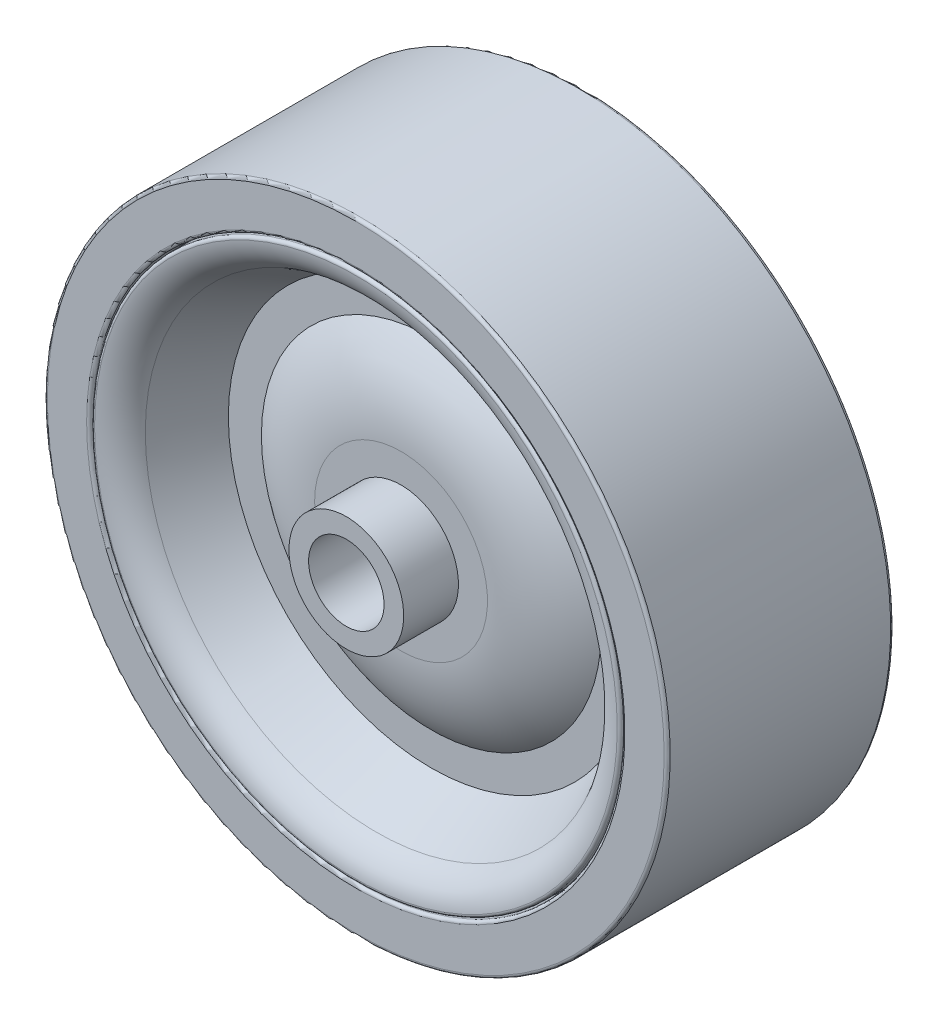
ISO-10303-21;
HEADER;
FILE_DESCRIPTION(('STEP AP214'),'2;1');
FILE_NAME('part.step','',(''),(''),'','','');
FILE_SCHEMA(('AUTOMOTIVE_DESIGN { 1 0 10303 214 1 1 1 1 }'));
ENDSEC;
DATA;
#1=APPLICATION_CONTEXT('core data for automotive mechanical design processes');
#2=APPLICATION_PROTOCOL_DEFINITION('international standard','automotive_design',2000,#1);
#3=PRODUCT_CONTEXT('',#1,'mechanical');
#4=PRODUCT('Part','Part','',(#3));
#5=PRODUCT_RELATED_PRODUCT_CATEGORY('part','',(#4));
#6=PRODUCT_DEFINITION_FORMATION('','',#4);
#7=PRODUCT_DEFINITION_CONTEXT('part definition',#1,'design');
#8=PRODUCT_DEFINITION('design','',#6,#7);
#9=PRODUCT_DEFINITION_SHAPE('','',#8);
#10=(LENGTH_UNIT() NAMED_UNIT(*) SI_UNIT(.MILLI.,.METRE.));
#11=(NAMED_UNIT(*) PLANE_ANGLE_UNIT() SI_UNIT($,.RADIAN.));
#12=(NAMED_UNIT(*) SI_UNIT($,.STERADIAN.) SOLID_ANGLE_UNIT());
#13=UNCERTAINTY_MEASURE_WITH_UNIT(LENGTH_MEASURE(1.E-05),#10,'distance_accuracy_value','');
#14=(GEOMETRIC_REPRESENTATION_CONTEXT(3) GLOBAL_UNCERTAINTY_ASSIGNED_CONTEXT((#13)) GLOBAL_UNIT_ASSIGNED_CONTEXT((#10,
#11,#12)) REPRESENTATION_CONTEXT('',''));
#15=CARTESIAN_POINT('',(0.,0.,0.));
#16=DIRECTION('',(0.,0.,1.));
#17=DIRECTION('',(1.,0.,0.));
#18=AXIS2_PLACEMENT_3D('',#15,#16,#17);
#19=CARTESIAN_POINT('',(0.,0.,-10.31875));
#20=DIRECTION('',(0.,0.,-1.));
#21=DIRECTION('',(-1.,0.,0.));
#22=AXIS2_PLACEMENT_3D('',#19,#20,#21);
#23=CYLINDRICAL_SURFACE('',#22,26.19375);
#24=CARTESIAN_POINT('',(0.,0.,-9.271));
#25=DIRECTION('',(0.,0.,-1.));
#26=DIRECTION('',(-1.,0.,0.));
#27=AXIS2_PLACEMENT_3D('',#24,#25,#26);
#28=CIRCLE('',#27,26.19375);
#29=CARTESIAN_POINT('',(-26.19375,0.,-9.271));
#30=VERTEX_POINT('',#29);
#31=EDGE_CURVE('E43',#30,#30,#28,.F.);
#32=ORIENTED_EDGE('',*,*,#31,.T.);
#33=EDGE_LOOP('',(#32));
#34=FACE_BOUND('',#33,.T.);
#35=CARTESIAN_POINT('',(0.,0.,9.271));
#36=DIRECTION('',(0.,0.,-1.));
#37=DIRECTION('',(-1.,0.,0.));
#38=AXIS2_PLACEMENT_3D('',#35,#36,#37);
#39=CIRCLE('',#38,26.19375);
#40=CARTESIAN_POINT('',(-26.19375,0.,9.271));
#41=VERTEX_POINT('',#40);
#42=EDGE_CURVE('E90',#41,#41,#39,.F.);
#43=ORIENTED_EDGE('',*,*,#42,.F.);
#44=EDGE_LOOP('',(#43));
#45=FACE_BOUND('',#44,.T.);
#46=ADVANCED_FACE('F28',(#34,#45),#23,.T.);
#47=CARTESIAN_POINT('',(-1.82909978638645E-13,-26.19375,-9.525));
#48=DIRECTION('',(0.,0.,-1.));
#49=DIRECTION('',(-1.,0.,0.));
#50=AXIS2_PLACEMENT_3D('',#47,#48,#49);
#51=PLANE('',#50);
#52=CARTESIAN_POINT('',(0.,0.,-9.525));
#53=DIRECTION('',(0.,0.,-1.));
#54=DIRECTION('',(-1.,0.,0.));
#55=AXIS2_PLACEMENT_3D('',#52,#53,#54);
#56=CIRCLE('',#55,25.93975);
#57=CARTESIAN_POINT('',(-25.93975,0.,-9.525));
#58=VERTEX_POINT('',#57);
#59=EDGE_CURVE('E48',#58,#58,#56,.T.);
#60=ORIENTED_EDGE('',*,*,#59,.T.);
#61=EDGE_LOOP('',(#60));
#62=FACE_BOUND('',#61,.T.);
#63=CARTESIAN_POINT('',(0.,0.,-9.525));
#64=DIRECTION('',(0.,0.,-1.));
#65=DIRECTION('',(-1.,0.,0.));
#66=AXIS2_PLACEMENT_3D('',#63,#64,#65);
#67=CIRCLE('',#66,22.63775);
#68=CARTESIAN_POINT('',(-22.63775,0.,-9.525));
#69=VERTEX_POINT('',#68);
#70=EDGE_CURVE('E51',#69,#69,#67,.F.);
#71=ORIENTED_EDGE('',*,*,#70,.T.);
#72=EDGE_LOOP('',(#71));
#73=FACE_BOUND('',#72,.T.);
#74=ADVANCED_FACE('F147',(#62,#73),#51,.T.);
#75=CARTESIAN_POINT('',(0.,0.,-10.31875));
#76=DIRECTION('',(0.,0.,-1.));
#77=DIRECTION('',(-1.,0.,0.));
#78=AXIS2_PLACEMENT_3D('',#75,#76,#77);
#79=CYLINDRICAL_SURFACE('',#78,22.38375);
#80=CARTESIAN_POINT('',(0.,0.,-9.271));
#81=DIRECTION('',(0.,0.,-1.));
#82=DIRECTION('',(-1.,0.,0.));
#83=AXIS2_PLACEMENT_3D('',#80,#81,#82);
#84=CIRCLE('',#83,22.38375);
#85=CARTESIAN_POINT('',(-22.38375,0.,-9.271));
#86=VERTEX_POINT('',#85);
#87=EDGE_CURVE('E39',#86,#86,#84,.T.);
#88=ORIENTED_EDGE('',*,*,#87,.T.);
#89=EDGE_LOOP('',(#88));
#90=FACE_BOUND('',#89,.T.);
#91=CARTESIAN_POINT('',(0.,0.,-6.985));
#92=DIRECTION('',(0.,0.,-1.));
#93=DIRECTION('',(-1.,0.,0.));
#94=AXIS2_PLACEMENT_3D('',#91,#92,#93);
#95=CIRCLE('',#94,22.38375);
#96=CARTESIAN_POINT('',(-22.38375,0.,-6.985));
#97=VERTEX_POINT('',#96);
#98=EDGE_CURVE('E54',#97,#97,#95,.T.);
#99=ORIENTED_EDGE('',*,*,#98,.F.);
#100=EDGE_LOOP('',(#99));
#101=FACE_BOUND('',#100,.T.);
#102=ADVANCED_FACE('F153',(#90,#101),#79,.F.);
#103=CARTESIAN_POINT('',(-1.5630489083666E-13,-22.38375,-6.985));
#104=DIRECTION('',(0.,0.,-1.));
#105=DIRECTION('',(-1.,0.,0.));
#106=AXIS2_PLACEMENT_3D('',#103,#104,#105);
#107=PLANE('',#106);
#108=ORIENTED_EDGE('',*,*,#98,.T.);
#109=EDGE_LOOP('',(#108));
#110=FACE_BOUND('',#109,.T.);
#111=CARTESIAN_POINT('',(0.,0.,-6.985));
#112=DIRECTION('',(0.,0.,-1.));
#113=DIRECTION('',(-1.,0.,0.));
#114=AXIS2_PLACEMENT_3D('',#111,#112,#113);
#115=CIRCLE('',#114,22.25675);
#116=CARTESIAN_POINT('',(-22.25675,0.,-6.985));
#117=VERTEX_POINT('',#116);
#118=EDGE_CURVE('E57',#117,#117,#115,.T.);
#119=ORIENTED_EDGE('',*,*,#118,.F.);
#120=EDGE_LOOP('',(#119));
#121=FACE_BOUND('',#120,.T.);
#122=ADVANCED_FACE('F171',(#110,#121),#107,.T.);
#123=CARTESIAN_POINT('',(0.,0.,-10.31875));
#124=DIRECTION('',(0.,0.,-1.));
#125=DIRECTION('',(-1.,0.,0.));
#126=AXIS2_PLACEMENT_3D('',#123,#124,#125);
#127=CYLINDRICAL_SURFACE('',#126,22.25675);
#128=CARTESIAN_POINT('',(0.,0.,-9.25993556629696));
#129=DIRECTION('',(0.,0.,1.));
#130=DIRECTION('',(1.,0.,0.));
#131=AXIS2_PLACEMENT_3D('',#128,#129,#130);
#132=CIRCLE('',#131,22.25675);
#133=CARTESIAN_POINT('',(22.25675,0.,-9.25993556629696));
#134=VERTEX_POINT('',#133);
#135=EDGE_CURVE('E10',#134,#134,#132,.T.);
#136=ORIENTED_EDGE('',*,*,#135,.T.);
#137=EDGE_LOOP('',(#136));
#138=FACE_BOUND('',#137,.T.);
#139=ORIENTED_EDGE('',*,*,#118,.T.);
#140=EDGE_LOOP('',(#139));
#141=FACE_BOUND('',#140,.T.);
#142=ADVANCED_FACE('F176',(#138,#141),#127,.T.);
#143=CARTESIAN_POINT('',(0.,0.,-6.35));
#144=DIRECTION('',(0.,0.,-1.));
#145=DIRECTION('',(-1.,0.,0.));
#146=AXIS2_PLACEMENT_3D('',#143,#144,#145);
#147=TOROIDAL_SURFACE('',#146,22.25675,3.175);
#148=CARTESIAN_POINT('',(0.,0.,-9.51297344162677));
#149=DIRECTION('',(0.,0.,1.));
#150=DIRECTION('',(1.,0.,0.));
#151=AXIS2_PLACEMENT_3D('',#148,#149,#150);
#152=CIRCLE('',#151,21.9806630434783);
#153=CARTESIAN_POINT('',(21.9806630434783,0.,-9.51297344162677));
#154=VERTEX_POINT('',#153);
#155=EDGE_CURVE('E35',#154,#154,#152,.F.);
#156=ORIENTED_EDGE('',*,*,#155,.T.);
#157=EDGE_LOOP('',(#156));
#158=FACE_BOUND('',#157,.T.);
#159=CARTESIAN_POINT('',(0.,0.,-7.79627388058178));
#160=DIRECTION('',(0.,0.,-1.));
#161=DIRECTION('',(-1.,0.,0.));
#162=AXIS2_PLACEMENT_3D('',#159,#160,#161);
#163=CIRCLE('',#162,19.4302827947512);
#164=CARTESIAN_POINT('',(-19.4302827947512,0.,-7.79627388058178));
#165=VERTEX_POINT('',#164);
#166=EDGE_CURVE('E60',#165,#165,#163,.T.);
#167=ORIENTED_EDGE('',*,*,#166,.F.);
#168=EDGE_LOOP('',(#167));
#169=FACE_BOUND('',#168,.T.);
#170=ADVANCED_FACE('F181',(#158,#169),#147,.T.);
#171=CARTESIAN_POINT('',(0.,0.,-3.17499999999999));
#172=DIRECTION('',(0.,0.,-1.));
#173=DIRECTION('',(-1.,0.,0.));
#174=AXIS2_PLACEMENT_3D('',#171,#172,#173);
#175=CONICAL_SURFACE('',#174,17.065625,0.472955498677827);
#176=ORIENTED_EDGE('',*,*,#166,.T.);
#177=EDGE_LOOP('',(#176));
#178=FACE_BOUND('',#177,.T.);
#179=CARTESIAN_POINT('',(0.,0.,-3.17499999999999));
#180=DIRECTION('',(0.,0.,-1.));
#181=DIRECTION('',(-1.,0.,0.));
#182=AXIS2_PLACEMENT_3D('',#179,#180,#181);
#183=CIRCLE('',#182,17.065625);
#184=CARTESIAN_POINT('',(-17.065625,0.,-3.17499999999999));
#185=VERTEX_POINT('',#184);
#186=EDGE_CURVE('E63',#185,#185,#183,.T.);
#187=ORIENTED_EDGE('',*,*,#186,.F.);
#188=EDGE_LOOP('',(#187));
#189=FACE_BOUND('',#188,.T.);
#190=ADVANCED_FACE('F186',(#178,#189),#175,.F.);
#191=CARTESIAN_POINT('',(0.,-14.2875,-3.17499999999999));
#192=DIRECTION('',(0.,0.,-1.));
#193=DIRECTION('',(-1.,0.,0.));
#194=AXIS2_PLACEMENT_3D('',#191,#192,#193);
#195=PLANE('',#194);
#196=ORIENTED_EDGE('',*,*,#186,.T.);
#197=EDGE_LOOP('',(#196));
#198=FACE_BOUND('',#197,.T.);
#199=CARTESIAN_POINT('',(0.,0.,-3.17499999999999));
#200=DIRECTION('',(0.,0.,-1.));
#201=DIRECTION('',(-1.,0.,0.));
#202=AXIS2_PLACEMENT_3D('',#199,#200,#201);
#203=CIRCLE('',#202,14.2875);
#204=CARTESIAN_POINT('',(-14.2875,0.,-3.17499999999999));
#205=VERTEX_POINT('',#204);
#206=EDGE_CURVE('E66',#205,#205,#203,.T.);
#207=ORIENTED_EDGE('',*,*,#206,.F.);
#208=EDGE_LOOP('',(#207));
#209=FACE_BOUND('',#208,.T.);
#210=ADVANCED_FACE('F191',(#198,#209),#195,.T.);
#211=CARTESIAN_POINT('',(0.,0.,5.25045778842444));
#212=DIRECTION('',(0.,0.,-1.));
#213=DIRECTION('',(-1.,0.,0.));
#214=AXIS2_PLACEMENT_3D('',#211,#212,#213);
#215=DEGENERATE_TOROIDAL_SURFACE('',#214,7.26945714139644,10.9654577884244,.T.);
#216=ORIENTED_EDGE('',*,*,#206,.T.);
#217=EDGE_LOOP('',(#216));
#218=FACE_BOUND('',#217,.T.);
#219=CARTESIAN_POINT('',(0.,0.,-5.715));
#220=DIRECTION('',(0.,0.,-1.));
#221=DIRECTION('',(-1.,0.,0.));
#222=AXIS2_PLACEMENT_3D('',#219,#220,#221);
#223=CIRCLE('',#222,7.26945714139644);
#224=CARTESIAN_POINT('',(-7.26945714139644,0.,-5.715));
#225=VERTEX_POINT('',#224);
#226=EDGE_CURVE('E69',#225,#225,#223,.T.);
#227=ORIENTED_EDGE('',*,*,#226,.F.);
#228=EDGE_LOOP('',(#227));
#229=FACE_BOUND('',#228,.T.);
#230=ADVANCED_FACE('F195',(#218,#229),#215,.T.);
#231=CARTESIAN_POINT('',(0.,-7.26945714139645,-5.715));
#232=DIRECTION('',(0.,0.,-1.));
#233=DIRECTION('',(-1.,0.,0.));
#234=AXIS2_PLACEMENT_3D('',#231,#232,#233);
#235=PLANE('',#234);
#236=ORIENTED_EDGE('',*,*,#226,.T.);
#237=EDGE_LOOP('',(#236));
#238=FACE_BOUND('',#237,.T.);
#239=CARTESIAN_POINT('',(0.,0.,-5.715));
#240=DIRECTION('',(0.,0.,-1.));
#241=DIRECTION('',(-1.,0.,0.));
#242=AXIS2_PLACEMENT_3D('',#239,#240,#241);
#243=CIRCLE('',#242,4.826);
#244=CARTESIAN_POINT('',(-4.826,0.,-5.715));
#245=VERTEX_POINT('',#244);
#246=EDGE_CURVE('E72',#245,#245,#243,.T.);
#247=ORIENTED_EDGE('',*,*,#246,.F.);
#248=EDGE_LOOP('',(#247));
#249=FACE_BOUND('',#248,.T.);
#250=ADVANCED_FACE('F199',(#238,#249),#235,.T.);
#251=CARTESIAN_POINT('',(0.,0.,-10.31875));
#252=DIRECTION('',(0.,0.,-1.));
#253=DIRECTION('',(-1.,0.,0.));
#254=AXIS2_PLACEMENT_3D('',#251,#252,#253);
#255=CYLINDRICAL_SURFACE('',#254,4.826);
#256=ORIENTED_EDGE('',*,*,#246,.T.);
#257=EDGE_LOOP('',(#256));
#258=FACE_BOUND('',#257,.T.);
#259=CARTESIAN_POINT('',(0.,0.,-10.31875));
#260=DIRECTION('',(0.,0.,-1.));
#261=DIRECTION('',(-1.,0.,0.));
#262=AXIS2_PLACEMENT_3D('',#259,#260,#261);
#263=CIRCLE('',#262,4.826);
#264=CARTESIAN_POINT('',(-4.826,0.,-10.31875));
#265=VERTEX_POINT('',#264);
#266=EDGE_CURVE('E75',#265,#265,#263,.T.);
#267=ORIENTED_EDGE('',*,*,#266,.F.);
#268=EDGE_LOOP('',(#267));
#269=FACE_BOUND('',#268,.T.);
#270=ADVANCED_FACE('F142',(#258,#269),#255,.T.);
#271=CARTESIAN_POINT('',(0.,-3.175,-10.31875));
#272=DIRECTION('',(0.,0.,-1.));
#273=DIRECTION('',(-1.,0.,0.));
#274=AXIS2_PLACEMENT_3D('',#271,#272,#273);
#275=PLANE('',#274);
#276=ORIENTED_EDGE('',*,*,#266,.T.);
#277=EDGE_LOOP('',(#276));
#278=FACE_BOUND('',#277,.T.);
#279=CARTESIAN_POINT('',(0.,0.,-10.31875));
#280=DIRECTION('',(0.,0.,-1.));
#281=DIRECTION('',(-1.,0.,0.));
#282=AXIS2_PLACEMENT_3D('',#279,#280,#281);
#283=CIRCLE('',#282,3.175);
#284=CARTESIAN_POINT('',(-3.175,0.,-10.31875));
#285=VERTEX_POINT('',#284);
#286=EDGE_CURVE('E78',#285,#285,#283,.T.);
#287=ORIENTED_EDGE('',*,*,#286,.F.);
#288=EDGE_LOOP('',(#287));
#289=FACE_BOUND('',#288,.T.);
#290=ADVANCED_FACE('F132',(#278,#289),#275,.T.);
#291=CARTESIAN_POINT('',(0.,0.,-10.31875));
#292=DIRECTION('',(0.,0.,-1.));
#293=DIRECTION('',(-1.,0.,0.));
#294=AXIS2_PLACEMENT_3D('',#291,#292,#293);
#295=CYLINDRICAL_SURFACE('',#294,3.175);
#296=ORIENTED_EDGE('',*,*,#286,.T.);
#297=EDGE_LOOP('',(#296));
#298=FACE_BOUND('',#297,.T.);
#299=CARTESIAN_POINT('',(0.,0.,10.31875));
#300=DIRECTION('',(0.,0.,-1.));
#301=DIRECTION('',(-1.,0.,0.));
#302=AXIS2_PLACEMENT_3D('',#299,#300,#301);
#303=CIRCLE('',#302,3.175);
#304=CARTESIAN_POINT('',(-3.175,0.,10.31875));
#305=VERTEX_POINT('',#304);
#306=EDGE_CURVE('E123',#305,#305,#303,.T.);
#307=ORIENTED_EDGE('',*,*,#306,.F.);
#308=EDGE_LOOP('',(#307));
#309=FACE_BOUND('',#308,.T.);
#310=ADVANCED_FACE('F129',(#298,#309),#295,.F.);
#311=CARTESIAN_POINT('',(0.,0.,-9.271));
#312=DIRECTION('',(0.,0.,-1.));
#313=DIRECTION('',(-1.,0.,0.));
#314=AXIS2_PLACEMENT_3D('',#311,#312,#313);
#315=TOROIDAL_SURFACE('',#314,25.93975,0.254);
#316=ORIENTED_EDGE('',*,*,#31,.F.);
#317=EDGE_LOOP('',(#316));
#318=FACE_BOUND('',#317,.T.);
#319=ORIENTED_EDGE('',*,*,#59,.F.);
#320=EDGE_LOOP('',(#319));
#321=FACE_BOUND('',#320,.T.);
#322=ADVANCED_FACE('F131',(#318,#321),#315,.T.);
#323=CARTESIAN_POINT('',(0.,0.,-9.271));
#324=DIRECTION('',(0.,0.,-1.));
#325=DIRECTION('',(-1.,0.,0.));
#326=AXIS2_PLACEMENT_3D('',#323,#324,#325);
#327=TOROIDAL_SURFACE('',#326,22.63775,0.254);
#328=ORIENTED_EDGE('',*,*,#70,.F.);
#329=EDGE_LOOP('',(#328));
#330=FACE_BOUND('',#329,.T.);
#331=ORIENTED_EDGE('',*,*,#87,.F.);
#332=EDGE_LOOP('',(#331));
#333=FACE_BOUND('',#332,.T.);
#334=ADVANCED_FACE('F139',(#330,#333),#327,.T.);
#335=CARTESIAN_POINT('',(0.,0.,-9.25993556629696));
#336=DIRECTION('',(0.,0.,1.));
#337=DIRECTION('',(1.,0.,0.));
#338=AXIS2_PLACEMENT_3D('',#335,#336,#337);
#339=TOROIDAL_SURFACE('',#338,22.00275,0.254);
#340=ORIENTED_EDGE('',*,*,#135,.F.);
#341=EDGE_LOOP('',(#340));
#342=FACE_BOUND('',#341,.T.);
#343=ORIENTED_EDGE('',*,*,#155,.F.);
#344=EDGE_LOOP('',(#343));
#345=FACE_BOUND('',#344,.T.);
#346=ADVANCED_FACE('F30',(#342,#345),#339,.T.);
#347=CARTESIAN_POINT('',(-1.82909978638645E-13,-26.19375,9.525));
#348=DIRECTION('',(0.,0.,1.));
#349=DIRECTION('',(-1.,0.,0.));
#350=AXIS2_PLACEMENT_3D('',#347,#348,#349);
#351=PLANE('',#350);
#352=CARTESIAN_POINT('',(0.,0.,9.525));
#353=DIRECTION('',(0.,0.,-1.));
#354=DIRECTION('',(-1.,0.,0.));
#355=AXIS2_PLACEMENT_3D('',#352,#353,#354);
#356=CIRCLE('',#355,25.93975);
#357=CARTESIAN_POINT('',(-25.93975,0.,9.525));
#358=VERTEX_POINT('',#357);
#359=EDGE_CURVE('E93',#358,#358,#356,.T.);
#360=ORIENTED_EDGE('',*,*,#359,.F.);
#361=EDGE_LOOP('',(#360));
#362=FACE_BOUND('',#361,.T.);
#363=CARTESIAN_POINT('',(0.,0.,9.525));
#364=DIRECTION('',(0.,0.,-1.));
#365=DIRECTION('',(-1.,0.,0.));
#366=AXIS2_PLACEMENT_3D('',#363,#364,#365);
#367=CIRCLE('',#366,22.63775);
#368=CARTESIAN_POINT('',(-22.63775,0.,9.525));
#369=VERTEX_POINT('',#368);
#370=EDGE_CURVE('E96',#369,#369,#367,.F.);
#371=ORIENTED_EDGE('',*,*,#370,.F.);
#372=EDGE_LOOP('',(#371));
#373=FACE_BOUND('',#372,.T.);
#374=ADVANCED_FACE('F163',(#362,#373),#351,.T.);
#375=CARTESIAN_POINT('',(0.,0.,10.31875));
#376=DIRECTION('',(0.,0.,1.));
#377=DIRECTION('',(-1.,0.,0.));
#378=AXIS2_PLACEMENT_3D('',#375,#376,#377);
#379=CYLINDRICAL_SURFACE('',#378,22.38375);
#380=CARTESIAN_POINT('',(0.,0.,9.271));
#381=DIRECTION('',(0.,0.,-1.));
#382=DIRECTION('',(-1.,0.,0.));
#383=AXIS2_PLACEMENT_3D('',#380,#381,#382);
#384=CIRCLE('',#383,22.38375);
#385=CARTESIAN_POINT('',(-22.38375,0.,9.271));
#386=VERTEX_POINT('',#385);
#387=EDGE_CURVE('E87',#386,#386,#384,.T.);
#388=ORIENTED_EDGE('',*,*,#387,.F.);
#389=EDGE_LOOP('',(#388));
#390=FACE_BOUND('',#389,.T.);
#391=CARTESIAN_POINT('',(0.,0.,6.985));
#392=DIRECTION('',(0.,0.,-1.));
#393=DIRECTION('',(-1.,0.,0.));
#394=AXIS2_PLACEMENT_3D('',#391,#392,#393);
#395=CIRCLE('',#394,22.38375);
#396=CARTESIAN_POINT('',(-22.38375,0.,6.985));
#397=VERTEX_POINT('',#396);
#398=EDGE_CURVE('E99',#397,#397,#395,.T.);
#399=ORIENTED_EDGE('',*,*,#398,.T.);
#400=EDGE_LOOP('',(#399));
#401=FACE_BOUND('',#400,.T.);
#402=ADVANCED_FACE('F307',(#390,#401),#379,.F.);
#403=CARTESIAN_POINT('',(-1.5630489083666E-13,-22.38375,6.985));
#404=DIRECTION('',(0.,0.,1.));
#405=DIRECTION('',(-1.,0.,0.));
#406=AXIS2_PLACEMENT_3D('',#403,#404,#405);
#407=PLANE('',#406);
#408=ORIENTED_EDGE('',*,*,#398,.F.);
#409=EDGE_LOOP('',(#408));
#410=FACE_BOUND('',#409,.T.);
#411=CARTESIAN_POINT('',(0.,0.,6.985));
#412=DIRECTION('',(0.,0.,-1.));
#413=DIRECTION('',(-1.,0.,0.));
#414=AXIS2_PLACEMENT_3D('',#411,#412,#413);
#415=CIRCLE('',#414,22.25675);
#416=CARTESIAN_POINT('',(-22.25675,0.,6.985));
#417=VERTEX_POINT('',#416);
#418=EDGE_CURVE('E102',#417,#417,#415,.T.);
#419=ORIENTED_EDGE('',*,*,#418,.T.);
#420=EDGE_LOOP('',(#419));
#421=FACE_BOUND('',#420,.T.);
#422=ADVANCED_FACE('F317',(#410,#421),#407,.T.);
#423=CARTESIAN_POINT('',(0.,0.,10.31875));
#424=DIRECTION('',(0.,0.,1.));
#425=DIRECTION('',(-1.,0.,0.));
#426=AXIS2_PLACEMENT_3D('',#423,#424,#425);
#427=CYLINDRICAL_SURFACE('',#426,22.25675);
#428=CARTESIAN_POINT('',(0.,0.,9.25993556629696));
#429=DIRECTION('',(0.,0.,1.));
#430=DIRECTION('',(1.,0.,0.));
#431=AXIS2_PLACEMENT_3D('',#428,#429,#430);
#432=CIRCLE('',#431,22.25675);
#433=CARTESIAN_POINT('',(22.25675,0.,9.25993556629696));
#434=VERTEX_POINT('',#433);
#435=EDGE_CURVE('E81',#434,#434,#432,.T.);
#436=ORIENTED_EDGE('',*,*,#435,.F.);
#437=EDGE_LOOP('',(#436));
#438=FACE_BOUND('',#437,.T.);
#439=ORIENTED_EDGE('',*,*,#418,.F.);
#440=EDGE_LOOP('',(#439));
#441=FACE_BOUND('',#440,.T.);
#442=ADVANCED_FACE('F327',(#438,#441),#427,.T.);
#443=CARTESIAN_POINT('',(0.,0.,6.35));
#444=DIRECTION('',(0.,0.,1.));
#445=DIRECTION('',(-1.,0.,0.));
#446=AXIS2_PLACEMENT_3D('',#443,#444,#445);
#447=TOROIDAL_SURFACE('',#446,22.25675,3.175);
#448=CARTESIAN_POINT('',(0.,0.,9.51297344162677));
#449=DIRECTION('',(0.,0.,1.));
#450=DIRECTION('',(1.,0.,0.));
#451=AXIS2_PLACEMENT_3D('',#448,#449,#450);
#452=CIRCLE('',#451,21.9806630434783);
#453=CARTESIAN_POINT('',(21.9806630434783,0.,9.51297344162677));
#454=VERTEX_POINT('',#453);
#455=EDGE_CURVE('E84',#454,#454,#452,.F.);
#456=ORIENTED_EDGE('',*,*,#455,.F.);
#457=EDGE_LOOP('',(#456));
#458=FACE_BOUND('',#457,.T.);
#459=CARTESIAN_POINT('',(0.,0.,7.79627388058178));
#460=DIRECTION('',(0.,0.,-1.));
#461=DIRECTION('',(-1.,0.,0.));
#462=AXIS2_PLACEMENT_3D('',#459,#460,#461);
#463=CIRCLE('',#462,19.4302827947512);
#464=CARTESIAN_POINT('',(-19.4302827947512,0.,7.79627388058178));
#465=VERTEX_POINT('',#464);
#466=EDGE_CURVE('E105',#465,#465,#463,.T.);
#467=ORIENTED_EDGE('',*,*,#466,.T.);
#468=EDGE_LOOP('',(#467));
#469=FACE_BOUND('',#468,.T.);
#470=ADVANCED_FACE('F337',(#458,#469),#447,.T.);
#471=CARTESIAN_POINT('',(0.,0.,3.17499999999999));
#472=DIRECTION('',(0.,0.,1.));
#473=DIRECTION('',(-1.,0.,0.));
#474=AXIS2_PLACEMENT_3D('',#471,#472,#473);
#475=CONICAL_SURFACE('',#474,17.065625,0.472955498677827);
#476=ORIENTED_EDGE('',*,*,#466,.F.);
#477=EDGE_LOOP('',(#476));
#478=FACE_BOUND('',#477,.T.);
#479=CARTESIAN_POINT('',(0.,0.,3.17499999999999));
#480=DIRECTION('',(0.,0.,-1.));
#481=DIRECTION('',(-1.,0.,0.));
#482=AXIS2_PLACEMENT_3D('',#479,#480,#481);
#483=CIRCLE('',#482,17.065625);
#484=CARTESIAN_POINT('',(-17.065625,0.,3.17499999999999));
#485=VERTEX_POINT('',#484);
#486=EDGE_CURVE('E108',#485,#485,#483,.T.);
#487=ORIENTED_EDGE('',*,*,#486,.T.);
#488=EDGE_LOOP('',(#487));
#489=FACE_BOUND('',#488,.T.);
#490=ADVANCED_FACE('F347',(#478,#489),#475,.F.);
#491=CARTESIAN_POINT('',(0.,-14.2875,3.17499999999999));
#492=DIRECTION('',(0.,0.,1.));
#493=DIRECTION('',(-1.,0.,0.));
#494=AXIS2_PLACEMENT_3D('',#491,#492,#493);
#495=PLANE('',#494);
#496=ORIENTED_EDGE('',*,*,#486,.F.);
#497=EDGE_LOOP('',(#496));
#498=FACE_BOUND('',#497,.T.);
#499=CARTESIAN_POINT('',(0.,0.,3.17499999999999));
#500=DIRECTION('',(0.,0.,-1.));
#501=DIRECTION('',(-1.,0.,0.));
#502=AXIS2_PLACEMENT_3D('',#499,#500,#501);
#503=CIRCLE('',#502,14.2875);
#504=CARTESIAN_POINT('',(-14.2875,0.,3.17499999999999));
#505=VERTEX_POINT('',#504);
#506=EDGE_CURVE('E111',#505,#505,#503,.T.);
#507=ORIENTED_EDGE('',*,*,#506,.T.);
#508=EDGE_LOOP('',(#507));
#509=FACE_BOUND('',#508,.T.);
#510=ADVANCED_FACE('F357',(#498,#509),#495,.T.);
#511=CARTESIAN_POINT('',(0.,0.,-5.25045778842444));
#512=DIRECTION('',(0.,0.,1.));
#513=DIRECTION('',(-1.,0.,0.));
#514=AXIS2_PLACEMENT_3D('',#511,#512,#513);
#515=DEGENERATE_TOROIDAL_SURFACE('',#514,7.26945714139644,10.9654577884244,.T.);
#516=ORIENTED_EDGE('',*,*,#506,.F.);
#517=EDGE_LOOP('',(#516));
#518=FACE_BOUND('',#517,.T.);
#519=CARTESIAN_POINT('',(0.,0.,5.715));
#520=DIRECTION('',(0.,0.,-1.));
#521=DIRECTION('',(-1.,0.,0.));
#522=AXIS2_PLACEMENT_3D('',#519,#520,#521);
#523=CIRCLE('',#522,7.26945714139644);
#524=CARTESIAN_POINT('',(-7.26945714139644,0.,5.715));
#525=VERTEX_POINT('',#524);
#526=EDGE_CURVE('E114',#525,#525,#523,.T.);
#527=ORIENTED_EDGE('',*,*,#526,.T.);
#528=EDGE_LOOP('',(#527));
#529=FACE_BOUND('',#528,.T.);
#530=ADVANCED_FACE('F367',(#518,#529),#515,.T.);
#531=CARTESIAN_POINT('',(0.,-7.26945714139645,5.715));
#532=DIRECTION('',(0.,0.,1.));
#533=DIRECTION('',(-1.,0.,0.));
#534=AXIS2_PLACEMENT_3D('',#531,#532,#533);
#535=PLANE('',#534);
#536=ORIENTED_EDGE('',*,*,#526,.F.);
#537=EDGE_LOOP('',(#536));
#538=FACE_BOUND('',#537,.T.);
#539=CARTESIAN_POINT('',(0.,0.,5.715));
#540=DIRECTION('',(0.,0.,-1.));
#541=DIRECTION('',(-1.,0.,0.));
#542=AXIS2_PLACEMENT_3D('',#539,#540,#541);
#543=CIRCLE('',#542,4.826);
#544=CARTESIAN_POINT('',(-4.826,0.,5.715));
#545=VERTEX_POINT('',#544);
#546=EDGE_CURVE('E117',#545,#545,#543,.T.);
#547=ORIENTED_EDGE('',*,*,#546,.T.);
#548=EDGE_LOOP('',(#547));
#549=FACE_BOUND('',#548,.T.);
#550=ADVANCED_FACE('F377',(#538,#549),#535,.T.);
#551=CARTESIAN_POINT('',(0.,0.,10.31875));
#552=DIRECTION('',(0.,0.,1.));
#553=DIRECTION('',(-1.,0.,0.));
#554=AXIS2_PLACEMENT_3D('',#551,#552,#553);
#555=CYLINDRICAL_SURFACE('',#554,4.826);
#556=ORIENTED_EDGE('',*,*,#546,.F.);
#557=EDGE_LOOP('',(#556));
#558=FACE_BOUND('',#557,.T.);
#559=CARTESIAN_POINT('',(0.,0.,10.31875));
#560=DIRECTION('',(0.,0.,-1.));
#561=DIRECTION('',(-1.,0.,0.));
#562=AXIS2_PLACEMENT_3D('',#559,#560,#561);
#563=CIRCLE('',#562,4.826);
#564=CARTESIAN_POINT('',(-4.826,0.,10.31875));
#565=VERTEX_POINT('',#564);
#566=EDGE_CURVE('E120',#565,#565,#563,.T.);
#567=ORIENTED_EDGE('',*,*,#566,.T.);
#568=EDGE_LOOP('',(#567));
#569=FACE_BOUND('',#568,.T.);
#570=ADVANCED_FACE('F387',(#558,#569),#555,.T.);
#571=CARTESIAN_POINT('',(0.,-3.175,10.31875));
#572=DIRECTION('',(0.,0.,1.));
#573=DIRECTION('',(-1.,0.,0.));
#574=AXIS2_PLACEMENT_3D('',#571,#572,#573);
#575=PLANE('',#574);
#576=ORIENTED_EDGE('',*,*,#566,.F.);
#577=EDGE_LOOP('',(#576));
#578=FACE_BOUND('',#577,.T.);
#579=ORIENTED_EDGE('',*,*,#306,.T.);
#580=EDGE_LOOP('',(#579));
#581=FACE_BOUND('',#580,.T.);
#582=ADVANCED_FACE('F127',(#578,#581),#575,.T.);
#583=CARTESIAN_POINT('',(0.,0.,9.271));
#584=DIRECTION('',(0.,0.,1.));
#585=DIRECTION('',(-1.,0.,0.));
#586=AXIS2_PLACEMENT_3D('',#583,#584,#585);
#587=TOROIDAL_SURFACE('',#586,25.93975,0.254);
#588=ORIENTED_EDGE('',*,*,#42,.T.);
#589=EDGE_LOOP('',(#588));
#590=FACE_BOUND('',#589,.T.);
#591=ORIENTED_EDGE('',*,*,#359,.T.);
#592=EDGE_LOOP('',(#591));
#593=FACE_BOUND('',#592,.T.);
#594=ADVANCED_FACE('F406',(#590,#593),#587,.T.);
#595=CARTESIAN_POINT('',(0.,0.,9.271));
#596=DIRECTION('',(0.,0.,1.));
#597=DIRECTION('',(-1.,0.,0.));
#598=AXIS2_PLACEMENT_3D('',#595,#596,#597);
#599=TOROIDAL_SURFACE('',#598,22.63775,0.254);
#600=ORIENTED_EDGE('',*,*,#370,.T.);
#601=EDGE_LOOP('',(#600));
#602=FACE_BOUND('',#601,.T.);
#603=ORIENTED_EDGE('',*,*,#387,.T.);
#604=EDGE_LOOP('',(#603));
#605=FACE_BOUND('',#604,.T.);
#606=ADVANCED_FACE('F416',(#602,#605),#599,.T.);
#607=CARTESIAN_POINT('',(0.,0.,9.25993556629696));
#608=DIRECTION('',(0.,0.,-1.));
#609=DIRECTION('',(1.,0.,0.));
#610=AXIS2_PLACEMENT_3D('',#607,#608,#609);
#611=TOROIDAL_SURFACE('',#610,22.00275,0.254);
#612=ORIENTED_EDGE('',*,*,#435,.T.);
#613=EDGE_LOOP('',(#612));
#614=FACE_BOUND('',#613,.T.);
#615=ORIENTED_EDGE('',*,*,#455,.T.);
#616=EDGE_LOOP('',(#615));
#617=FACE_BOUND('',#616,.T.);
#618=ADVANCED_FACE('F426',(#614,#617),#611,.T.);
#619=CLOSED_SHELL('',(#46,#74,#102,#122,#142,#170,#190,#210,#230,#250,#270,#290,#310,#322,#334,
#346,#374,#402,#422,#442,#470,#490,#510,#530,#550,#570,#582,#594,#606,#618));
#620=MANIFOLD_SOLID_BREP('B2',#619);
#621=ADVANCED_BREP_SHAPE_REPRESENTATION('',(#18,#620),#14);
#622=SHAPE_DEFINITION_REPRESENTATION(#9,#621);
ENDSEC;
END-ISO-10303-21;
